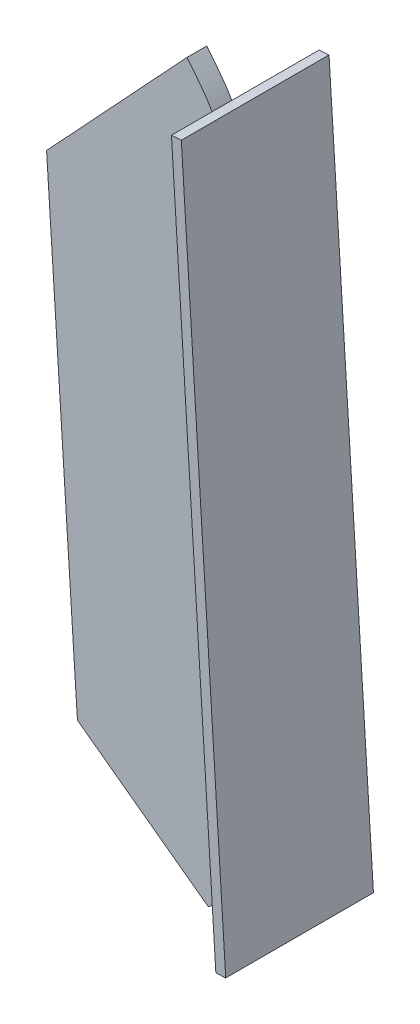
ISO-10303-21;
HEADER;
FILE_DESCRIPTION(('STEP AP214'),'2;1');
FILE_NAME('part.step','',(''),(''),'','','');
FILE_SCHEMA(('AUTOMOTIVE_DESIGN { 1 0 10303 214 1 1 1 1 }'));
ENDSEC;
DATA;
#1=APPLICATION_CONTEXT('core data for automotive mechanical design processes');
#2=APPLICATION_PROTOCOL_DEFINITION('international standard','automotive_design',2000,#1);
#3=PRODUCT_CONTEXT('',#1,'mechanical');
#4=PRODUCT('Part','Part','',(#3));
#5=PRODUCT_RELATED_PRODUCT_CATEGORY('part','',(#4));
#6=PRODUCT_DEFINITION_FORMATION('','',#4);
#7=PRODUCT_DEFINITION_CONTEXT('part definition',#1,'design');
#8=PRODUCT_DEFINITION('design','',#6,#7);
#9=PRODUCT_DEFINITION_SHAPE('','',#8);
#10=(LENGTH_UNIT() NAMED_UNIT(*) SI_UNIT(.MILLI.,.METRE.));
#11=(NAMED_UNIT(*) PLANE_ANGLE_UNIT() SI_UNIT($,.RADIAN.));
#12=(NAMED_UNIT(*) SI_UNIT($,.STERADIAN.) SOLID_ANGLE_UNIT());
#13=UNCERTAINTY_MEASURE_WITH_UNIT(LENGTH_MEASURE(1.E-05),#10,'distance_accuracy_value','');
#14=(GEOMETRIC_REPRESENTATION_CONTEXT(3) GLOBAL_UNCERTAINTY_ASSIGNED_CONTEXT((#13)) GLOBAL_UNIT_ASSIGNED_CONTEXT((#10,
#11,#12)) REPRESENTATION_CONTEXT('',''));
#15=CARTESIAN_POINT('',(0.,0.,0.));
#16=DIRECTION('',(0.,0.,1.));
#17=DIRECTION('',(1.,0.,0.));
#18=AXIS2_PLACEMENT_3D('',#15,#16,#17);
#19=CARTESIAN_POINT('',(4.23452332688885,18.5542325122525,0.));
#20=DIRECTION('',(0.,0.,-1.));
#21=DIRECTION('',(-1.,0.,0.));
#22=AXIS2_PLACEMENT_3D('',#19,#20,#21);
#23=PLANE('',#22);
#24=DIRECTION('',(0.0764088745643059,-0.99707656871868,0.));
#25=VECTOR('',#24,1.);
#26=CARTESIAN_POINT('',(-7.62067230182452,17.645734424795,0.));
#27=LINE('',#26,#25);
#28=CARTESIAN_POINT('',(-5.05248117334619,-15.8671685305005,0.));
#29=VERTEX_POINT('',#28);
#30=CARTESIAN_POINT('',(-5.02639999391516,-16.2075076997856,0.));
#31=VERTEX_POINT('',#30);
#32=EDGE_CURVE('E282',#29,#31,#27,.T.);
#33=ORIENTED_EDGE('',*,*,#32,.F.);
#34=DIRECTION('',(0.064382277997965,-0.997925308968458,0.));
#35=VECTOR('',#34,1.);
#36=CARTESIAN_POINT('',(-7.22551624759463,17.8148751203504,0.));
#37=LINE('',#36,#35);
#38=CARTESIAN_POINT('',(-6.90294848758231,12.8150748401594,0.));
#39=VERTEX_POINT('',#38);
#40=EDGE_CURVE('E284',#39,#29,#37,.T.);
#41=ORIENTED_EDGE('',*,*,#40,.F.);
#42=DIRECTION('',(-0.681391861748142,-0.731918800648953,0.));
#43=VECTOR('',#42,1.);
#44=CARTESIAN_POINT('',(1.13037541527084,21.4440901341139,0.));
#45=LINE('',#44,#43);
#46=CARTESIAN_POINT('',(1.61767217448219,21.9675211869221,0.));
#47=VERTEX_POINT('',#46);
#48=EDGE_CURVE('E313',#47,#39,#45,.T.);
#49=ORIENTED_EDGE('',*,*,#48,.F.);
#50=CARTESIAN_POINT('',(4.81621387452629,14.2443449041827,0.));
#51=CARTESIAN_POINT('',(4.74272079601164,14.9529919010958,0.));
#52=CARTESIAN_POINT('',(4.6700571393372,15.6617599741983,0.));
#53=CARTESIAN_POINT('',(4.44417770567255,16.7078497611603,0.));
#54=CARTESIAN_POINT('',(4.34921426645763,17.0510426966297,0.));
#55=CARTESIAN_POINT('',(4.1312981481527,17.7228963854365,0.));
#56=CARTESIAN_POINT('',(4.00807556147466,18.0527198465019,0.));
#57=CARTESIAN_POINT('',(3.60723438370154,19.0288520158619,0.));
#58=CARTESIAN_POINT('',(3.29954679479282,19.6622950600175,0.));
#59=CARTESIAN_POINT('',(2.72120097869071,20.5624780715779,0.));
#60=CARTESIAN_POINT('',(2.50985178519879,20.8520044751331,0.));
#61=CARTESIAN_POINT('',(2.07214429130566,21.4162262237605,0.));
#62=CARTESIAN_POINT('',(1.84506927155332,21.6919978782625,0.));
#63=CARTESIAN_POINT('',(1.61767217448139,21.9675211869215,0.));
#64=B_SPLINE_CURVE_WITH_KNOTS('',3,(#50,#51,#52,#53,#54,#55,#56,#57,#58,#59,#60,#61,#62,#63),
.UNSPECIFIED.,.F.,.F.,(4,2,2,2,2,2,4),(0.,0.249999999999999,0.374999999999999,0.499999999999999,
0.749999999999999,0.875,1.),.UNSPECIFIED.);
#65=CARTESIAN_POINT('',(4.81621387452629,14.2443449041827,0.));
#66=VERTEX_POINT('',#65);
#67=EDGE_CURVE('E306',#66,#47,#64,.T.);
#68=ORIENTED_EDGE('',*,*,#67,.F.);
#69=DIRECTION('',(-0.062995611239893,0.998013803994971,0.));
#70=VECTOR('',#69,1.);
#71=CARTESIAN_POINT('',(4.54294072231993,18.5737001210816,0.));
#72=LINE('',#71,#70);
#73=CARTESIAN_POINT('',(6.9010871743299,-18.7854533917801,0.));
#74=VERTEX_POINT('',#73);
#75=EDGE_CURVE('E303',#74,#66,#72,.T.);
#76=ORIENTED_EDGE('',*,*,#75,.F.);
#77=DIRECTION('',(0.773957299203321,0.633237790257263,0.));
#78=VECTOR('',#77,1.);
#79=CARTESIAN_POINT('',(23.6039321196708,-5.11948934559207,0.));
#80=LINE('',#79,#78);
#81=CARTESIAN_POINT('',(2.91971745903383,-22.042937704295,0.));
#82=VERTEX_POINT('',#81);
#83=EDGE_CURVE('E294',#82,#74,#80,.T.);
#84=ORIENTED_EDGE('',*,*,#83,.F.);
#85=DIRECTION('',(0.806004429494522,-0.59190950291004,0.));
#86=VECTOR('',#85,1.);
#87=CARTESIAN_POINT('',(-15.5942941470948,-8.44671043104431,0.));
#88=LINE('',#87,#86);
#89=EDGE_CURVE('E287',#31,#82,#88,.T.);
#90=ORIENTED_EDGE('',*,*,#89,.F.);
#91=EDGE_LOOP('',(#33,#41,#49,#68,#76,#84,#90));
#92=FACE_BOUND('',#91,.T.);
#93=ADVANCED_FACE('F97',(#92),#23,.T.);
#94=CARTESIAN_POINT('',(-7.22551624759463,17.8148751203504,0.));
#95=DIRECTION('',(-0.997925308968458,-0.064382277997965,0.));
#96=DIRECTION('',(0.064382277997965,-0.997925308968458,0.));
#97=AXIS2_PLACEMENT_3D('',#94,#95,#96);
#98=PLANE('',#97);
#99=DIRECTION('',(0.064382277997965,-0.997925308968458,0.));
#100=VECTOR('',#99,1.);
#101=CARTESIAN_POINT('',(-7.22551624759463,17.8148751203504,1.2));
#102=LINE('',#101,#100);
#103=CARTESIAN_POINT('',(-6.90294848758231,12.8150748401594,1.2));
#104=VERTEX_POINT('',#103);
#105=CARTESIAN_POINT('',(-5.05248117334619,-15.8671685305005,1.2));
#106=VERTEX_POINT('',#105);
#107=EDGE_CURVE('E321',#104,#106,#102,.T.);
#108=ORIENTED_EDGE('',*,*,#107,.F.);
#109=DIRECTION('',(0.,0.,1.));
#110=VECTOR('',#109,1.);
#111=CARTESIAN_POINT('',(-6.90294848758231,12.8150748401594,0.));
#112=LINE('',#111,#110);
#113=EDGE_CURVE('E352',#39,#104,#112,.T.);
#114=ORIENTED_EDGE('',*,*,#113,.F.);
#115=ORIENTED_EDGE('',*,*,#40,.T.);
#116=DIRECTION('',(0.,0.,1.));
#117=VECTOR('',#116,1.);
#118=CARTESIAN_POINT('',(-5.05248117334619,-15.8671685305005,0.));
#119=LINE('',#118,#117);
#120=EDGE_CURVE('E320',#29,#106,#119,.T.);
#121=ORIENTED_EDGE('',*,*,#120,.T.);
#122=EDGE_LOOP('',(#108,#114,#115,#121));
#123=FACE_BOUND('',#122,.T.);
#124=ADVANCED_FACE('F263',(#123),#98,.T.);
#125=CARTESIAN_POINT('',(1.13037541527084,21.4440901341139,0.));
#126=DIRECTION('',(-0.731918800648953,0.681391861748142,0.));
#127=DIRECTION('',(-0.681391861748142,-0.731918800648953,0.));
#128=AXIS2_PLACEMENT_3D('',#125,#126,#127);
#129=PLANE('',#128);
#130=DIRECTION('',(-0.681391861748142,-0.731918800648953,0.));
#131=VECTOR('',#130,1.);
#132=CARTESIAN_POINT('',(1.13037541527084,21.4440901341139,1.2));
#133=LINE('',#132,#131);
#134=CARTESIAN_POINT('',(1.61767217448219,21.9675211869221,1.2));
#135=VERTEX_POINT('',#134);
#136=EDGE_CURVE('E296',#135,#104,#133,.T.);
#137=ORIENTED_EDGE('',*,*,#136,.F.);
#138=DIRECTION('',(0.,0.,1.));
#139=VECTOR('',#138,1.);
#140=CARTESIAN_POINT('',(1.61767217448219,21.9675211869221,0.));
#141=LINE('',#140,#139);
#142=EDGE_CURVE('E356',#47,#135,#141,.T.);
#143=ORIENTED_EDGE('',*,*,#142,.F.);
#144=ORIENTED_EDGE('',*,*,#48,.T.);
#145=ORIENTED_EDGE('',*,*,#113,.T.);
#146=EDGE_LOOP('',(#137,#143,#144,#145));
#147=FACE_BOUND('',#146,.T.);
#148=ADVANCED_FACE('F261',(#147),#129,.T.);
#149=DIRECTION('',(0.,0.,1.));
#150=VECTOR('',#149,1.);
#151=SURFACE_OF_LINEAR_EXTRUSION('',#64,#150);
#152=CARTESIAN_POINT('',(4.81621387452629,14.2443449041827,0.380470854544368));
#153=CARTESIAN_POINT('',(4.81493892031543,14.2566371184256,0.368950368814834));
#154=CARTESIAN_POINT('',(4.8135626299961,14.269911589039,0.358497526730917));
#155=CARTESIAN_POINT('',(4.81064962706142,14.2980019199929,0.339976938877652));
#156=CARTESIAN_POINT('',(4.80911303615339,14.312816610901,0.331907401177261));
#157=CARTESIAN_POINT('',(4.80591892167884,14.3435909149679,0.318382108858626));
#158=CARTESIAN_POINT('',(4.80426134433604,14.3595510371968,0.312927524792751));
#159=CARTESIAN_POINT('',(4.80087110382359,14.3921514643899,0.304788508781725));
#160=CARTESIAN_POINT('',(4.7991384547773,14.408791641381,0.302103558118324));
#161=CARTESIAN_POINT('',(4.79564467697466,14.442280585764,0.299578874682713));
#162=CARTESIAN_POINT('',(4.79388355327794,14.459129315976,0.299738641867159));
#163=CARTESIAN_POINT('',(4.79037788279901,14.4925840744531,0.302899491842923));
#164=CARTESIAN_POINT('',(4.78863336274329,14.509189729009,0.3059045610109));
#165=CARTESIAN_POINT('',(4.78521385637877,14.5416428292034,0.314671496141483));
#166=CARTESIAN_POINT('',(4.78353879068006,14.5574911438697,0.320430114651555));
#167=CARTESIAN_POINT('',(4.78030140316875,14.5880224073432,0.334549947406798));
#168=CARTESIAN_POINT('',(4.7787392422147,14.602703696316,0.342914788139695));
#169=CARTESIAN_POINT('',(4.77577885568252,14.6304347486444,0.3619916430098));
#170=CARTESIAN_POINT('',(4.77438036034634,14.6434871991199,0.372699708910578));
#171=CARTESIAN_POINT('',(4.77178507641613,14.667635392332,0.396183120959086));
#172=CARTESIAN_POINT('',(4.77058857167194,14.6787283825093,0.408961327621645));
#173=CARTESIAN_POINT('',(4.76843992311238,14.6985967983791,0.436187928213184));
#174=CARTESIAN_POINT('',(4.76748725914119,14.7073771585058,0.450632669931743));
#175=CARTESIAN_POINT('',(4.76585258843841,14.7224130702958,0.480803332847992));
#176=CARTESIAN_POINT('',(4.76517096180363,14.7286650764586,0.49653101625049));
#177=CARTESIAN_POINT('',(4.76357572882477,14.7432832730471,0.54489808740456));
#178=CARTESIAN_POINT('',(4.76310005302369,14.74761924791,0.57887136548681));
#179=CARTESIAN_POINT('',(4.76340873508379,14.7447981022256,0.646308980099745));
#180=CARTESIAN_POINT('',(4.76419227963416,14.7376484000993,0.679773631054628));
#181=CARTESIAN_POINT('',(4.76621611271913,14.7190710533787,0.726694150104395));
#182=CARTESIAN_POINT('',(4.76703482935452,14.7115450551046,0.741817272336081));
#183=CARTESIAN_POINT('',(4.76892842790864,14.6940844352611,0.770575699333325));
#184=CARTESIAN_POINT('',(4.77000295143946,14.684153183141,0.784213047064702));
#185=CARTESIAN_POINT('',(4.77237693829407,14.66213567461,0.809643616895238));
#186=CARTESIAN_POINT('',(4.77367687746492,14.6500448577541,0.821432835320016));
#187=CARTESIAN_POINT('',(4.77645782176355,14.6240843631079,0.842789445737234));
#188=CARTESIAN_POINT('',(4.77793857334849,14.6102171749113,0.852359895580136));
#189=CARTESIAN_POINT('',(4.78104202408754,14.581048984862,0.869048353780277));
#190=CARTESIAN_POINT('',(4.78266504840545,14.5657446925167,0.876160550404627));
#191=CARTESIAN_POINT('',(4.78600068883626,14.5341869753902,0.887692328011253));
#192=CARTESIAN_POINT('',(4.78771317717221,14.517934900616,0.892115641069479));
#193=CARTESIAN_POINT('',(4.79118551037276,14.4848876995865,0.898166723357705));
#194=CARTESIAN_POINT('',(4.79294544669624,14.4680915097691,0.899788633095758));
#195=CARTESIAN_POINT('',(4.79645842167226,14.4344896150926,0.900172325887083));
#196=CARTESIAN_POINT('',(4.79821146655278,14.4176839570776,0.898938140272067));
#197=CARTESIAN_POINT('',(4.80166752137073,14.3844996947532,0.893650660935879));
#198=CARTESIAN_POINT('',(4.80337047733079,14.3681215531433,0.889594434319005));
#199=CARTESIAN_POINT('',(4.80667852509645,14.3362763365226,0.878773087241295));
#200=CARTESIAN_POINT('',(4.80828364527901,14.320808997381,0.872008756606908));
#201=CARTESIAN_POINT('',(4.8109763469875,14.2948515511531,0.857933078596354));
#202=CARTESIAN_POINT('',(4.81209452746449,14.2840690048544,0.851159630479531));
#203=CARTESIAN_POINT('',(4.81423200534327,14.2634561924033,0.836300625995748));
#204=CARTESIAN_POINT('',(4.81525140506814,14.2536249408578,0.828216451082027));
#205=CARTESIAN_POINT('',(4.81621387452629,14.2443449041827,0.819529145455858));
#206=B_SPLINE_CURVE_WITH_KNOTS('',3,(#152,#153,#154,#155,#156,#157,#158,#159,#160,#161,#162,
#163,#164,#165,#166,#167,#168,#169,#170,#171,#172,#173,#174,#175,#176,#177,#178,#179,#180,#181,
#182,#183,#184,#185,#186,#187,#188,#189,#190,#191,#192,#193,#194,#195,#196,#197,#198,#199,#200,
#201,#202,#203,#204,#205),.UNSPECIFIED.,.F.,.F.,(4,2,2,2,2,2,2,2,2,2,2,2,2,2,2,2,2,2,2,2,2,2,2,
2,2,2,4),(0.,0.0506177200389992,0.101197284763289,0.151799469725767,0.202392175800152,
0.252975988797104,0.303630776676805,0.354225970634842,0.404891883246301,0.455473074390997,
0.506124764158784,0.556667487009724,0.607280841978047,0.707980046552352,0.808614237214032,
0.859149586210401,0.909614547095238,0.960187364845991,1.01069006450537,1.0613113573931,
1.11186222831918,1.16251870536609,1.21310372524626,1.26374139589974,1.31436430867494,
1.35261280491742,1.39082124775199),.UNSPECIFIED.);
#207=CARTESIAN_POINT('',(4.81621387452629,14.2443449041827,0.380470854544368));
#208=VERTEX_POINT('',#207);
#209=CARTESIAN_POINT('',(4.81621387452629,14.2443449041827,0.819529145455858));
#210=VERTEX_POINT('',#209);
#211=EDGE_CURVE('E220',#208,#210,#206,.T.);
#212=ORIENTED_EDGE('',*,*,#211,.F.);
#213=DIRECTION('',(0.,0.,1.));
#214=VECTOR('',#213,1.);
#215=CARTESIAN_POINT('',(4.81621387452629,14.2443449041827,0.));
#216=LINE('',#215,#214);
#217=EDGE_CURVE('E359',#66,#208,#216,.T.);
#218=ORIENTED_EDGE('',*,*,#217,.F.);
#219=ORIENTED_EDGE('',*,*,#67,.T.);
#220=ORIENTED_EDGE('',*,*,#142,.T.);
#221=CARTESIAN_POINT('',(4.81621387452629,14.2443449041827,1.2));
#222=CARTESIAN_POINT('',(4.74272079601164,14.9529919010958,1.2));
#223=CARTESIAN_POINT('',(4.6700571393372,15.6617599741983,1.2));
#224=CARTESIAN_POINT('',(4.44417770567255,16.7078497611603,1.2));
#225=CARTESIAN_POINT('',(4.34921426645763,17.0510426966297,1.2));
#226=CARTESIAN_POINT('',(4.1312981481527,17.7228963854365,1.2));
#227=CARTESIAN_POINT('',(4.00807556147466,18.0527198465019,1.2));
#228=CARTESIAN_POINT('',(3.60723438370154,19.0288520158619,1.2));
#229=CARTESIAN_POINT('',(3.29954679479282,19.6622950600175,1.2));
#230=CARTESIAN_POINT('',(2.72120097869071,20.5624780715779,1.2));
#231=CARTESIAN_POINT('',(2.50985178519879,20.8520044751331,1.2));
#232=CARTESIAN_POINT('',(2.07214429130566,21.4162262237605,1.2));
#233=CARTESIAN_POINT('',(1.84506927155332,21.6919978782625,1.2));
#234=CARTESIAN_POINT('',(1.61767217448139,21.9675211869215,1.2));
#235=B_SPLINE_CURVE_WITH_KNOTS('',3,(#221,#222,#223,#224,#225,#226,#227,#228,#229,#230,#231,
#232,#233,#234),.UNSPECIFIED.,.F.,.F.,(4,2,2,2,2,2,4),(0.,0.249999999999999,0.374999999999999,
0.499999999999999,0.749999999999999,0.875,1.),.UNSPECIFIED.);
#236=CARTESIAN_POINT('',(4.81621387452629,14.2443449041827,1.2));
#237=VERTEX_POINT('',#236);
#238=EDGE_CURVE('E340',#237,#135,#235,.T.);
#239=ORIENTED_EDGE('',*,*,#238,.F.);
#240=EDGE_CURVE('E362',#210,#237,#216,.T.);
#241=ORIENTED_EDGE('',*,*,#240,.F.);
#242=EDGE_LOOP('',(#212,#218,#219,#220,#239,#241));
#243=FACE_BOUND('',#242,.T.);
#244=ADVANCED_FACE('F237',(#243),#151,.T.);
#245=CARTESIAN_POINT('',(4.54294072231993,18.5737001210816,0.));
#246=DIRECTION('',(0.998013803994971,0.062995611239893,0.));
#247=DIRECTION('',(-0.062995611239893,0.998013803994971,0.));
#248=AXIS2_PLACEMENT_3D('',#245,#246,#247);
#249=PLANE('',#248);
#250=CARTESIAN_POINT('',(4.80333332004146,14.4484062812525,0.600000000000113));
#251=DIRECTION('',(0.998013803994971,0.062995611239893,0.));
#252=DIRECTION('',(-0.062995611239893,0.998013803994971,0.));
#253=AXIS2_PLACEMENT_3D('',#250,#251,#252);
#254=CIRCLE('',#253,0.299999999999999);
#255=EDGE_CURVE('E12',#210,#208,#254,.T.);
#256=ORIENTED_EDGE('',*,*,#255,.F.);
#257=ORIENTED_EDGE('',*,*,#240,.T.);
#258=DIRECTION('',(-0.062995611239893,0.998013803994971,0.));
#259=VECTOR('',#258,1.);
#260=CARTESIAN_POINT('',(4.54294072231993,18.5737001210816,1.2));
#261=LINE('',#260,#259);
#262=CARTESIAN_POINT('',(6.9010871743299,-18.7854533917801,1.2));
#263=VERTEX_POINT('',#262);
#264=EDGE_CURVE('E336',#263,#237,#261,.T.);
#265=ORIENTED_EDGE('',*,*,#264,.F.);
#266=DIRECTION('',(0.,0.,1.));
#267=VECTOR('',#266,1.);
#268=CARTESIAN_POINT('',(6.9010871743299,-18.7854533917801,0.));
#269=LINE('',#268,#267);
#270=CARTESIAN_POINT('',(6.90108717432989,-18.7854533917801,0.6));
#271=VERTEX_POINT('',#270);
#272=EDGE_CURVE('E366',#271,#263,#269,.T.);
#273=ORIENTED_EDGE('',*,*,#272,.F.);
#274=CARTESIAN_POINT('',(6.88218849095793,-18.4860492505816,0.6));
#275=DIRECTION('',(0.998013803994971,0.062995611239893,0.));
#276=DIRECTION('',(-0.062995611239893,0.998013803994971,0.));
#277=AXIS2_PLACEMENT_3D('',#274,#275,#276);
#278=CIRCLE('',#277,0.300000000000001);
#279=EDGE_CURVE('E326',#271,#271,#278,.T.);
#280=ORIENTED_EDGE('',*,*,#279,.F.);
#281=EDGE_CURVE('E363',#74,#271,#269,.T.);
#282=ORIENTED_EDGE('',*,*,#281,.F.);
#283=ORIENTED_EDGE('',*,*,#75,.T.);
#284=ORIENTED_EDGE('',*,*,#217,.T.);
#285=EDGE_LOOP('',(#256,#257,#265,#273,#280,#282,#283,#284));
#286=FACE_BOUND('',#285,.T.);
#287=CARTESIAN_POINT('',(5.49628504368029,3.47025443730779,0.600000000000075));
#288=DIRECTION('',(0.998013803994971,0.062995611239893,0.));
#289=DIRECTION('',(-0.062995611239893,0.998013803994971,0.));
#290=AXIS2_PLACEMENT_3D('',#287,#288,#289);
#291=CIRCLE('',#290,0.3);
#292=CARTESIAN_POINT('',(5.47738636030832,3.76965857850629,0.600000000000075));
#293=VERTEX_POINT('',#292);
#294=EDGE_CURVE('E105',#293,#293,#291,.T.);
#295=ORIENTED_EDGE('',*,*,#294,.F.);
#296=EDGE_LOOP('',(#295));
#297=FACE_BOUND('',#296,.T.);
#298=CARTESIAN_POINT('',(6.18923676731911,-7.50789740663689,0.600000000000038));
#299=DIRECTION('',(0.998013803994971,0.062995611239893,0.));
#300=DIRECTION('',(-0.062995611239893,0.998013803994971,0.));
#301=AXIS2_PLACEMENT_3D('',#298,#299,#300);
#302=CIRCLE('',#301,0.3);
#303=CARTESIAN_POINT('',(6.17033808394714,-7.2084932654384,0.600000000000038));
#304=VERTEX_POINT('',#303);
#305=EDGE_CURVE('E355',#304,#304,#302,.T.);
#306=ORIENTED_EDGE('',*,*,#305,.F.);
#307=EDGE_LOOP('',(#306));
#308=FACE_BOUND('',#307,.T.);
#309=ADVANCED_FACE('F269',(#286,#297,#308),#249,.T.);
#310=CARTESIAN_POINT('',(23.6039321196708,-5.11948934559207,0.));
#311=DIRECTION('',(0.633237790257262,-0.773957299203321,0.));
#312=DIRECTION('',(0.773957299203321,0.633237790257262,0.));
#313=AXIS2_PLACEMENT_3D('',#310,#311,#312);
#314=PLANE('',#313);
#315=DIRECTION('',(0.773957299203321,0.633237790257263,0.));
#316=VECTOR('',#315,1.);
#317=CARTESIAN_POINT('',(23.6039321196708,-5.11948934559207,1.2));
#318=LINE('',#317,#316);
#319=CARTESIAN_POINT('',(2.91971745903383,-22.042937704295,1.2));
#320=VERTEX_POINT('',#319);
#321=EDGE_CURVE('E332',#320,#263,#318,.T.);
#322=ORIENTED_EDGE('',*,*,#321,.F.);
#323=DIRECTION('',(0.,0.,1.));
#324=VECTOR('',#323,1.);
#325=CARTESIAN_POINT('',(2.91971745903383,-22.042937704295,0.));
#326=LINE('',#325,#324);
#327=EDGE_CURVE('E367',#82,#320,#326,.T.);
#328=ORIENTED_EDGE('',*,*,#327,.F.);
#329=ORIENTED_EDGE('',*,*,#83,.T.);
#330=ORIENTED_EDGE('',*,*,#281,.T.);
#331=ORIENTED_EDGE('',*,*,#272,.T.);
#332=EDGE_LOOP('',(#322,#328,#329,#330,#331));
#333=FACE_BOUND('',#332,.T.);
#334=ADVANCED_FACE('F384',(#333),#314,.T.);
#335=CARTESIAN_POINT('',(-15.5942941470948,-8.44671043104431,0.));
#336=DIRECTION('',(-0.59190950291004,-0.806004429494522,0.));
#337=DIRECTION('',(0.806004429494522,-0.59190950291004,0.));
#338=AXIS2_PLACEMENT_3D('',#335,#336,#337);
#339=PLANE('',#338);
#340=DIRECTION('',(0.806004429494522,-0.59190950291004,0.));
#341=VECTOR('',#340,1.);
#342=CARTESIAN_POINT('',(-15.5942941470948,-8.44671043104431,1.2));
#343=LINE('',#342,#341);
#344=CARTESIAN_POINT('',(-5.02639999391516,-16.2075076997856,1.2));
#345=VERTEX_POINT('',#344);
#346=EDGE_CURVE('E118',#345,#320,#343,.T.);
#347=ORIENTED_EDGE('',*,*,#346,.F.);
#348=DIRECTION('',(0.,0.,1.));
#349=VECTOR('',#348,1.);
#350=CARTESIAN_POINT('',(-5.02639999391516,-16.2075076997856,0.));
#351=LINE('',#350,#349);
#352=EDGE_CURVE('E370',#31,#345,#351,.T.);
#353=ORIENTED_EDGE('',*,*,#352,.F.);
#354=ORIENTED_EDGE('',*,*,#89,.T.);
#355=ORIENTED_EDGE('',*,*,#327,.T.);
#356=EDGE_LOOP('',(#347,#353,#354,#355));
#357=FACE_BOUND('',#356,.T.);
#358=ADVANCED_FACE('F412',(#357),#339,.T.);
#359=CARTESIAN_POINT('',(-7.62067230182452,17.645734424795,0.));
#360=DIRECTION('',(-0.99707656871868,-0.0764088745643059,0.));
#361=DIRECTION('',(0.0764088745643059,-0.99707656871868,0.));
#362=AXIS2_PLACEMENT_3D('',#359,#360,#361);
#363=PLANE('',#362);
#364=DIRECTION('',(0.0764088745643059,-0.99707656871868,0.));
#365=VECTOR('',#364,1.);
#366=CARTESIAN_POINT('',(-7.62067230182452,17.645734424795,1.2));
#367=LINE('',#366,#365);
#368=EDGE_CURVE('E325',#106,#345,#367,.T.);
#369=ORIENTED_EDGE('',*,*,#368,.F.);
#370=ORIENTED_EDGE('',*,*,#120,.F.);
#371=ORIENTED_EDGE('',*,*,#32,.T.);
#372=ORIENTED_EDGE('',*,*,#352,.T.);
#373=EDGE_LOOP('',(#369,#370,#371,#372));
#374=FACE_BOUND('',#373,.T.);
#375=ADVANCED_FACE('F533',(#374),#363,.T.);
#376=CARTESIAN_POINT('',(4.23452332688885,18.5542325122525,1.2));
#377=DIRECTION('',(0.,0.,-1.));
#378=DIRECTION('',(-1.,0.,0.));
#379=AXIS2_PLACEMENT_3D('',#376,#377,#378);
#380=PLANE('',#379);
#381=ORIENTED_EDGE('',*,*,#107,.T.);
#382=ORIENTED_EDGE('',*,*,#368,.T.);
#383=ORIENTED_EDGE('',*,*,#346,.T.);
#384=ORIENTED_EDGE('',*,*,#321,.T.);
#385=ORIENTED_EDGE('',*,*,#264,.T.);
#386=ORIENTED_EDGE('',*,*,#238,.T.);
#387=ORIENTED_EDGE('',*,*,#136,.T.);
#388=EDGE_LOOP('',(#381,#382,#383,#384,#385,#386,#387));
#389=FACE_BOUND('',#388,.T.);
#390=ADVANCED_FACE('F259',(#389),#380,.F.);
#391=CARTESIAN_POINT('',(5.68457192616397,-18.5616439840694,0.6));
#392=DIRECTION('',(0.998013803994971,0.062995611239893,0.));
#393=DIRECTION('',(-0.062995611239893,0.998013803994971,0.));
#394=AXIS2_PLACEMENT_3D('',#391,#392,#393);
#395=CYLINDRICAL_SURFACE('',#394,0.300000000000001);
#396=ORIENTED_EDGE('',*,*,#279,.T.);
#397=EDGE_LOOP('',(#396));
#398=FACE_BOUND('',#397,.T.);
#399=CARTESIAN_POINT('',(7.18159263215643,-18.4671505672096,0.6));
#400=DIRECTION('',(0.998013803994971,0.062995611239893,0.));
#401=DIRECTION('',(-0.062995611239893,0.998013803994971,0.));
#402=AXIS2_PLACEMENT_3D('',#399,#400,#401);
#403=CIRCLE('',#402,0.300000000000001);
#404=CARTESIAN_POINT('',(7.16269394878446,-18.1677464260111,0.6));
#405=VERTEX_POINT('',#404);
#406=EDGE_CURVE('E392',#405,#405,#403,.T.);
#407=ORIENTED_EDGE('',*,*,#406,.F.);
#408=EDGE_LOOP('',(#407));
#409=FACE_BOUND('',#408,.T.);
#410=ADVANCED_FACE('F256',(#398,#409),#395,.T.);
#411=CARTESIAN_POINT('',(4.99162020252515,-7.58349214012476,0.600000000000038));
#412=DIRECTION('',(0.998013803994971,0.062995611239893,0.));
#413=DIRECTION('',(-0.062995611239893,0.998013803994971,0.));
#414=AXIS2_PLACEMENT_3D('',#411,#412,#413);
#415=CYLINDRICAL_SURFACE('',#414,0.3);
#416=ORIENTED_EDGE('',*,*,#305,.T.);
#417=EDGE_LOOP('',(#416));
#418=FACE_BOUND('',#417,.T.);
#419=CARTESIAN_POINT('',(6.4886409085176,-7.48899872326492,0.600000000000038));
#420=DIRECTION('',(0.998013803994971,0.062995611239893,0.));
#421=DIRECTION('',(-0.062995611239893,0.998013803994971,0.));
#422=AXIS2_PLACEMENT_3D('',#419,#420,#421);
#423=CIRCLE('',#422,0.3);
#424=CARTESIAN_POINT('',(6.46974222514563,-7.18959458206643,0.600000000000038));
#425=VERTEX_POINT('',#424);
#426=EDGE_CURVE('E389',#425,#425,#423,.T.);
#427=ORIENTED_EDGE('',*,*,#426,.F.);
#428=EDGE_LOOP('',(#427));
#429=FACE_BOUND('',#428,.T.);
#430=ADVANCED_FACE('F252',(#418,#429),#415,.T.);
#431=CARTESIAN_POINT('',(4.29866847888632,3.39465970381992,0.600000000000075));
#432=DIRECTION('',(0.998013803994971,0.062995611239893,0.));
#433=DIRECTION('',(-0.062995611239893,0.998013803994971,0.));
#434=AXIS2_PLACEMENT_3D('',#431,#432,#433);
#435=CYLINDRICAL_SURFACE('',#434,0.3);
#436=ORIENTED_EDGE('',*,*,#294,.T.);
#437=EDGE_LOOP('',(#436));
#438=FACE_BOUND('',#437,.T.);
#439=CARTESIAN_POINT('',(5.79568918487878,3.48915312067976,0.600000000000075));
#440=DIRECTION('',(0.998013803994971,0.062995611239893,0.));
#441=DIRECTION('',(-0.062995611239893,0.998013803994971,0.));
#442=AXIS2_PLACEMENT_3D('',#439,#440,#441);
#443=CIRCLE('',#442,0.3);
#444=CARTESIAN_POINT('',(5.77679050150681,3.78855726187825,0.600000000000075));
#445=VERTEX_POINT('',#444);
#446=EDGE_CURVE('E235',#445,#445,#443,.T.);
#447=ORIENTED_EDGE('',*,*,#446,.F.);
#448=EDGE_LOOP('',(#447));
#449=FACE_BOUND('',#448,.T.);
#450=ADVANCED_FACE('F247',(#438,#449),#435,.T.);
#451=CARTESIAN_POINT('',(3.6057167552475,14.3728115477646,0.600000000000113));
#452=DIRECTION('',(0.998013803994971,0.062995611239893,0.));
#453=DIRECTION('',(-0.062995611239893,0.998013803994971,0.));
#454=AXIS2_PLACEMENT_3D('',#451,#452,#453);
#455=CYLINDRICAL_SURFACE('',#454,0.299999999999999);
#456=ORIENTED_EDGE('',*,*,#255,.T.);
#457=ORIENTED_EDGE('',*,*,#211,.T.);
#458=EDGE_LOOP('',(#456,#457));
#459=FACE_BOUND('',#458,.T.);
#460=CARTESIAN_POINT('',(5.10273746123996,14.4673049646244,0.600000000000113));
#461=DIRECTION('',(0.998013803994971,0.062995611239893,0.));
#462=DIRECTION('',(-0.062995611239893,0.998013803994971,0.));
#463=AXIS2_PLACEMENT_3D('',#460,#461,#462);
#464=CIRCLE('',#463,0.299999999999999);
#465=CARTESIAN_POINT('',(5.08383877786799,14.7667091058229,0.600000000000113));
#466=VERTEX_POINT('',#465);
#467=EDGE_CURVE('E215',#466,#466,#464,.T.);
#468=ORIENTED_EDGE('',*,*,#467,.F.);
#469=EDGE_LOOP('',(#468));
#470=FACE_BOUND('',#469,.T.);
#471=ADVANCED_FACE('F242',(#459,#470),#455,.T.);
#472=CARTESIAN_POINT('',(5.2644029061408,21.4305782105897,5.18675441747864));
#473=DIRECTION('',(0.,0.,-1.));
#474=DIRECTION('',(-1.,0.,0.));
#475=AXIS2_PLACEMENT_3D('',#472,#473,#474);
#476=PLANE('',#475);
#477=DIRECTION('',(0.0629956112398931,-0.998013803994971,0.));
#478=VECTOR('',#477,1.);
#479=CARTESIAN_POINT('',(4.66559462374381,21.3927808438458,5.18675441747864));
#480=LINE('',#479,#478);
#481=CARTESIAN_POINT('',(4.66559462374381,21.3927808438458,5.18675441747864));
#482=VERTEX_POINT('',#481);
#483=CARTESIAN_POINT('',(7.36098080038871,-21.309124232445,5.18675441747864));
#484=VERTEX_POINT('',#483);
#485=EDGE_CURVE('E213',#482,#484,#480,.T.);
#486=ORIENTED_EDGE('',*,*,#485,.T.);
#487=DIRECTION('',(-0.998013803994971,-0.062995611239893,0.));
#488=VECTOR('',#487,1.);
#489=CARTESIAN_POINT('',(7.95978908278569,-21.2713268657011,5.18675441747864));
#490=LINE('',#489,#488);
#491=CARTESIAN_POINT('',(7.95978908278569,-21.2713268657011,5.18675441747864));
#492=VERTEX_POINT('',#491);
#493=EDGE_CURVE('E191',#492,#484,#490,.T.);
#494=ORIENTED_EDGE('',*,*,#493,.F.);
#495=DIRECTION('',(0.0629956112398931,-0.998013803994971,0.));
#496=VECTOR('',#495,1.);
#497=CARTESIAN_POINT('',(5.2644029061408,21.4305782105897,5.18675441747864));
#498=LINE('',#497,#496);
#499=CARTESIAN_POINT('',(5.2644029061408,21.4305782105897,5.18675441747864));
#500=VERTEX_POINT('',#499);
#501=EDGE_CURVE('E199',#500,#492,#498,.T.);
#502=ORIENTED_EDGE('',*,*,#501,.F.);
#503=DIRECTION('',(-0.998013803994971,-0.062995611239893,0.));
#504=VECTOR('',#503,1.);
#505=CARTESIAN_POINT('',(5.2644029061408,21.4305782105897,5.18675441747864));
#506=LINE('',#505,#504);
#507=EDGE_CURVE('E437',#500,#482,#506,.T.);
#508=ORIENTED_EDGE('',*,*,#507,.T.);
#509=EDGE_LOOP('',(#486,#494,#502,#508));
#510=FACE_BOUND('',#509,.T.);
#511=ADVANCED_FACE('F211',(#510),#476,.F.);
#512=CARTESIAN_POINT('',(7.95978908278569,-21.2713268657011,5.18675441747864));
#513=DIRECTION('',(-0.062995611239893,0.998013803994971,0.));
#514=DIRECTION('',(-0.998013803994971,-0.062995611239893,0.));
#515=AXIS2_PLACEMENT_3D('',#512,#513,#514);
#516=PLANE('',#515);
#517=DIRECTION('',(0.,0.,-1.));
#518=VECTOR('',#517,1.);
#519=CARTESIAN_POINT('',(7.36098080038871,-21.309124232445,5.18675441747864));
#520=LINE('',#519,#518);
#521=CARTESIAN_POINT('',(7.36098080038871,-21.309124232445,-3.78137735400932));
#522=VERTEX_POINT('',#521);
#523=EDGE_CURVE('E424',#484,#522,#520,.T.);
#524=ORIENTED_EDGE('',*,*,#523,.T.);
#525=DIRECTION('',(-0.998013803994971,-0.062995611239893,0.));
#526=VECTOR('',#525,1.);
#527=CARTESIAN_POINT('',(7.95978908278569,-21.2713268657011,-3.78137735400932));
#528=LINE('',#527,#526);
#529=CARTESIAN_POINT('',(7.95978908278569,-21.2713268657011,-3.78137735400932));
#530=VERTEX_POINT('',#529);
#531=EDGE_CURVE('E194',#530,#522,#528,.T.);
#532=ORIENTED_EDGE('',*,*,#531,.F.);
#533=DIRECTION('',(0.,0.,-1.));
#534=VECTOR('',#533,1.);
#535=CARTESIAN_POINT('',(7.95978908278569,-21.2713268657011,5.18675441747864));
#536=LINE('',#535,#534);
#537=EDGE_CURVE('E187',#492,#530,#536,.T.);
#538=ORIENTED_EDGE('',*,*,#537,.F.);
#539=ORIENTED_EDGE('',*,*,#493,.T.);
#540=EDGE_LOOP('',(#524,#532,#538,#539));
#541=FACE_BOUND('',#540,.T.);
#542=ADVANCED_FACE('F189',(#541),#516,.F.);
#543=CARTESIAN_POINT('',(5.2644029061408,21.4305782105897,-3.78137735400932));
#544=DIRECTION('',(0.,0.,1.));
#545=DIRECTION('',(1.,0.,0.));
#546=AXIS2_PLACEMENT_3D('',#543,#544,#545);
#547=PLANE('',#546);
#548=DIRECTION('',(-0.0629956112398931,0.998013803994971,0.));
#549=VECTOR('',#548,1.);
#550=CARTESIAN_POINT('',(4.66559462374381,21.3927808438458,-3.78137735400932));
#551=LINE('',#550,#549);
#552=CARTESIAN_POINT('',(4.66559462374381,21.3927808438458,-3.78137735400932));
#553=VERTEX_POINT('',#552);
#554=EDGE_CURVE('E428',#522,#553,#551,.T.);
#555=ORIENTED_EDGE('',*,*,#554,.T.);
#556=DIRECTION('',(-0.998013803994971,-0.062995611239893,0.));
#557=VECTOR('',#556,1.);
#558=CARTESIAN_POINT('',(5.2644029061408,21.4305782105897,-3.78137735400932));
#559=LINE('',#558,#557);
#560=CARTESIAN_POINT('',(5.2644029061408,21.4305782105897,-3.78137735400932));
#561=VERTEX_POINT('',#560);
#562=EDGE_CURVE('E222',#561,#553,#559,.T.);
#563=ORIENTED_EDGE('',*,*,#562,.F.);
#564=DIRECTION('',(-0.0629956112398931,0.998013803994971,0.));
#565=VECTOR('',#564,1.);
#566=CARTESIAN_POINT('',(5.2644029061408,21.4305782105897,-3.78137735400932));
#567=LINE('',#566,#565);
#568=EDGE_CURVE('E198',#530,#561,#567,.T.);
#569=ORIENTED_EDGE('',*,*,#568,.F.);
#570=ORIENTED_EDGE('',*,*,#531,.T.);
#571=EDGE_LOOP('',(#555,#563,#569,#570));
#572=FACE_BOUND('',#571,.T.);
#573=ADVANCED_FACE('F445',(#572),#547,.F.);
#574=CARTESIAN_POINT('',(5.2644029061408,21.4305782105897,5.18675441747864));
#575=DIRECTION('',(0.062995611239893,-0.998013803994971,0.));
#576=DIRECTION('',(0.998013803994971,0.062995611239893,0.));
#577=AXIS2_PLACEMENT_3D('',#574,#575,#576);
#578=PLANE('',#577);
#579=DIRECTION('',(0.,0.,1.));
#580=VECTOR('',#579,1.);
#581=CARTESIAN_POINT('',(4.66559462374381,21.3927808438458,5.18675441747864));
#582=LINE('',#581,#580);
#583=EDGE_CURVE('E209',#553,#482,#582,.T.);
#584=ORIENTED_EDGE('',*,*,#583,.T.);
#585=ORIENTED_EDGE('',*,*,#507,.F.);
#586=DIRECTION('',(0.,0.,1.));
#587=VECTOR('',#586,1.);
#588=CARTESIAN_POINT('',(5.2644029061408,21.4305782105897,5.18675441747864));
#589=LINE('',#588,#587);
#590=EDGE_CURVE('E204',#561,#500,#589,.T.);
#591=ORIENTED_EDGE('',*,*,#590,.F.);
#592=ORIENTED_EDGE('',*,*,#562,.T.);
#593=EDGE_LOOP('',(#584,#585,#591,#592));
#594=FACE_BOUND('',#593,.T.);
#595=ADVANCED_FACE('F443',(#594),#578,.F.);
#596=CARTESIAN_POINT('',(6.59086234672764,0.416021702774159,0.));
#597=DIRECTION('',(0.998013803994971,0.0629956112398931,0.));
#598=DIRECTION('',(-0.0629956112398931,0.998013803994971,0.));
#599=AXIS2_PLACEMENT_3D('',#596,#597,#598);
#600=PLANE('',#599);
#601=ORIENTED_EDGE('',*,*,#501,.T.);
#602=ORIENTED_EDGE('',*,*,#537,.T.);
#603=ORIENTED_EDGE('',*,*,#568,.T.);
#604=ORIENTED_EDGE('',*,*,#590,.T.);
#605=EDGE_LOOP('',(#601,#602,#603,#604));
#606=FACE_BOUND('',#605,.T.);
#607=ADVANCED_FACE('F202',(#606),#600,.T.);
#608=CARTESIAN_POINT('',(5.99205406433065,0.378224336030223,0.));
#609=DIRECTION('',(0.998013803994971,0.0629956112398931,0.));
#610=DIRECTION('',(-0.0629956112398931,0.998013803994971,0.));
#611=AXIS2_PLACEMENT_3D('',#608,#609,#610);
#612=PLANE('',#611);
#613=ORIENTED_EDGE('',*,*,#406,.T.);
#614=EDGE_LOOP('',(#613));
#615=FACE_BOUND('',#614,.T.);
#616=ORIENTED_EDGE('',*,*,#426,.T.);
#617=EDGE_LOOP('',(#616));
#618=FACE_BOUND('',#617,.T.);
#619=ORIENTED_EDGE('',*,*,#446,.T.);
#620=EDGE_LOOP('',(#619));
#621=FACE_BOUND('',#620,.T.);
#622=ORIENTED_EDGE('',*,*,#467,.T.);
#623=EDGE_LOOP('',(#622));
#624=FACE_BOUND('',#623,.T.);
#625=ORIENTED_EDGE('',*,*,#485,.F.);
#626=ORIENTED_EDGE('',*,*,#583,.F.);
#627=ORIENTED_EDGE('',*,*,#554,.F.);
#628=ORIENTED_EDGE('',*,*,#523,.F.);
#629=EDGE_LOOP('',(#625,#626,#627,#628));
#630=FACE_BOUND('',#629,.T.);
#631=ADVANCED_FACE('F417',(#615,#618,#621,#624,#630),#612,.F.);
#632=CLOSED_SHELL('',(#93,#124,#148,#244,#309,#334,#358,#375,#390,#410,#430,#450,#471,#511,#542,
#573,#595,#607,#631));
#633=MANIFOLD_SOLID_BREP('B2',#632);
#634=ADVANCED_BREP_SHAPE_REPRESENTATION('',(#18,#633),#14);
#635=SHAPE_DEFINITION_REPRESENTATION(#9,#634);
ENDSEC;
END-ISO-10303-21;
